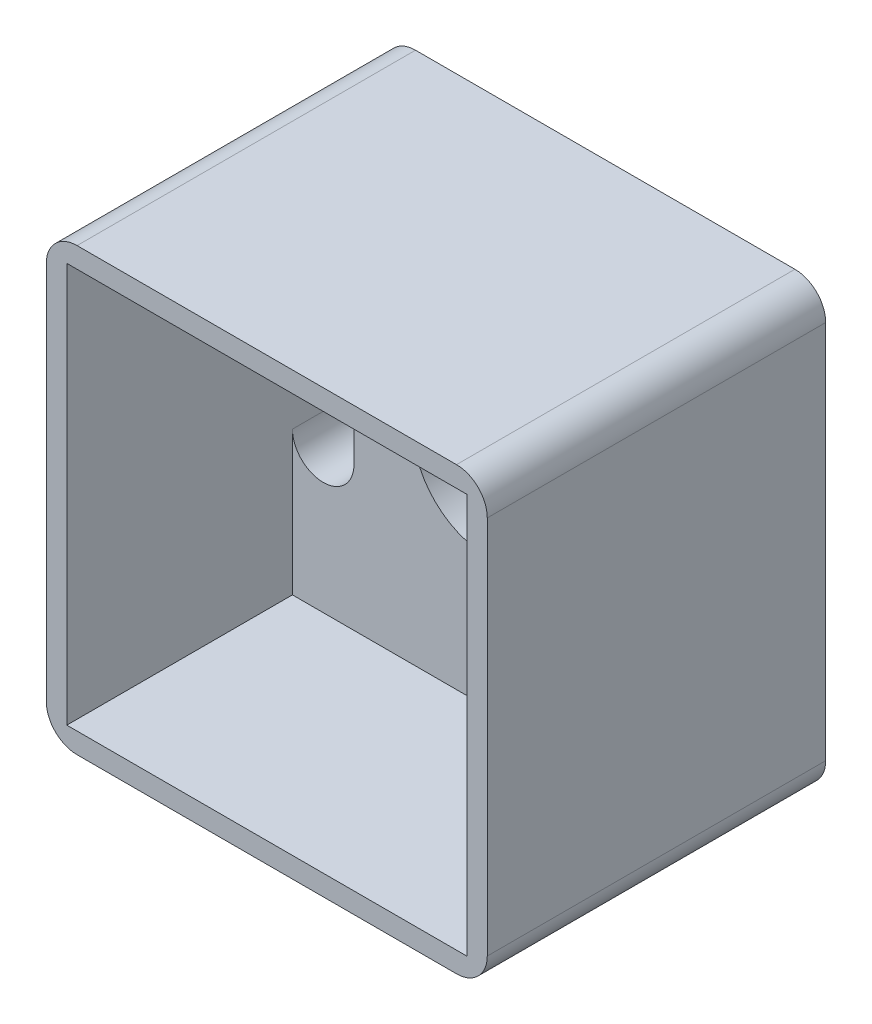
ISO-10303-21;
HEADER;
FILE_DESCRIPTION(('STEP AP214'),'2;1');
FILE_NAME('part.step','',(''),(''),'','','');
FILE_SCHEMA(('AUTOMOTIVE_DESIGN { 1 0 10303 214 1 1 1 1 }'));
ENDSEC;
DATA;
#1=APPLICATION_CONTEXT('core data for automotive mechanical design processes');
#2=APPLICATION_PROTOCOL_DEFINITION('international standard','automotive_design',2000,#1);
#3=PRODUCT_CONTEXT('',#1,'mechanical');
#4=PRODUCT('Part','Part','',(#3));
#5=PRODUCT_RELATED_PRODUCT_CATEGORY('part','',(#4));
#6=PRODUCT_DEFINITION_FORMATION('','',#4);
#7=PRODUCT_DEFINITION_CONTEXT('part definition',#1,'design');
#8=PRODUCT_DEFINITION('design','',#6,#7);
#9=PRODUCT_DEFINITION_SHAPE('','',#8);
#10=(LENGTH_UNIT() NAMED_UNIT(*) SI_UNIT(.MILLI.,.METRE.));
#11=(NAMED_UNIT(*) PLANE_ANGLE_UNIT() SI_UNIT($,.RADIAN.));
#12=(NAMED_UNIT(*) SI_UNIT($,.STERADIAN.) SOLID_ANGLE_UNIT());
#13=UNCERTAINTY_MEASURE_WITH_UNIT(LENGTH_MEASURE(1.E-05),#10,'distance_accuracy_value','');
#14=(GEOMETRIC_REPRESENTATION_CONTEXT(3) GLOBAL_UNCERTAINTY_ASSIGNED_CONTEXT((#13)) GLOBAL_UNIT_ASSIGNED_CONTEXT((#10,
#11,#12)) REPRESENTATION_CONTEXT('',''));
#15=CARTESIAN_POINT('',(0.,0.,0.));
#16=DIRECTION('',(0.,0.,1.));
#17=DIRECTION('',(1.,0.,0.));
#18=AXIS2_PLACEMENT_3D('',#15,#16,#17);
#19=CARTESIAN_POINT('',(-10.8125564669842,0.,12.));
#20=DIRECTION('',(1.,0.,0.));
#21=DIRECTION('',(0.,0.,-1.));
#22=AXIS2_PLACEMENT_3D('',#19,#20,#21);
#23=PLANE('',#22);
#24=DIRECTION('',(0.,0.,-1.));
#25=VECTOR('',#24,1.);
#26=CARTESIAN_POINT('',(-10.8125564669842,-23.2158524057952,0.));
#27=LINE('',#26,#25);
#28=CARTESIAN_POINT('',(-10.8125564669842,-23.2158524057952,12.));
#29=VERTEX_POINT('',#28);
#30=CARTESIAN_POINT('',(-10.8125564669842,-23.2158524057952,7.));
#31=VERTEX_POINT('',#30);
#32=EDGE_CURVE('E260',#29,#31,#27,.T.);
#33=ORIENTED_EDGE('',*,*,#32,.T.);
#34=DIRECTION('',(0.,1.,0.));
#35=VECTOR('',#34,1.);
#36=CARTESIAN_POINT('',(-10.8125564669842,0.,7.));
#37=LINE('',#36,#35);
#38=CARTESIAN_POINT('',(-10.8125564669842,-14.8158524057952,7.));
#39=VERTEX_POINT('',#38);
#40=EDGE_CURVE('E748',#31,#39,#37,.T.);
#41=ORIENTED_EDGE('',*,*,#40,.T.);
#42=DIRECTION('',(0.,0.,-1.));
#43=VECTOR('',#42,1.);
#44=CARTESIAN_POINT('',(-10.8125564669842,-14.8158524057952,12.));
#45=LINE('',#44,#43);
#46=CARTESIAN_POINT('',(-10.8125564669842,-14.8158524057952,12.));
#47=VERTEX_POINT('',#46);
#48=EDGE_CURVE('E258',#39,#47,#45,.F.);
#49=ORIENTED_EDGE('',*,*,#48,.T.);
#50=DIRECTION('',(0.,-1.,0.));
#51=VECTOR('',#50,1.);
#52=CARTESIAN_POINT('',(-10.8125564669842,0.,12.));
#53=LINE('',#52,#51);
#54=EDGE_CURVE('E410',#47,#29,#53,.T.);
#55=ORIENTED_EDGE('',*,*,#54,.T.);
#56=EDGE_LOOP('',(#33,#41,#49,#55));
#57=FACE_BOUND('',#56,.T.);
#58=ADVANCED_FACE('F39',(#57),#23,.T.);
#59=CARTESIAN_POINT('',(0.,-28.2158524057952,12.));
#60=DIRECTION('',(0.,1.,0.));
#61=DIRECTION('',(0.,0.,1.));
#62=AXIS2_PLACEMENT_3D('',#59,#60,#61);
#63=PLANE('',#62);
#64=DIRECTION('',(-1.,0.,0.));
#65=VECTOR('',#64,1.);
#66=CARTESIAN_POINT('',(0.,-28.2158524057952,7.));
#67=LINE('',#66,#65);
#68=CARTESIAN_POINT('',(-15.8125564669842,-28.2158524057952,7.));
#69=VERTEX_POINT('',#68);
#70=CARTESIAN_POINT('',(-24.2125564669842,-28.2158524057952,7.));
#71=VERTEX_POINT('',#70);
#72=EDGE_CURVE('E53',#69,#71,#67,.T.);
#73=ORIENTED_EDGE('',*,*,#72,.F.);
#74=DIRECTION('',(0.,0.,-1.));
#75=VECTOR('',#74,1.);
#76=CARTESIAN_POINT('',(-15.8125564669842,-28.2158524057952,12.));
#77=LINE('',#76,#75);
#78=CARTESIAN_POINT('',(-15.8125564669842,-28.2158524057952,12.));
#79=VERTEX_POINT('',#78);
#80=EDGE_CURVE('E262',#69,#79,#77,.F.);
#81=ORIENTED_EDGE('',*,*,#80,.T.);
#82=DIRECTION('',(1.,0.,0.));
#83=VECTOR('',#82,1.);
#84=CARTESIAN_POINT('',(0.,-28.2158524057952,12.));
#85=LINE('',#84,#83);
#86=CARTESIAN_POINT('',(-24.2125564669842,-28.2158524057952,12.));
#87=VERTEX_POINT('',#86);
#88=EDGE_CURVE('E316',#87,#79,#85,.T.);
#89=ORIENTED_EDGE('',*,*,#88,.F.);
#90=DIRECTION('',(0.,0.,-1.));
#91=VECTOR('',#90,1.);
#92=CARTESIAN_POINT('',(-24.2125564669842,-28.2158524057952,12.));
#93=LINE('',#92,#91);
#94=EDGE_CURVE('E265',#87,#71,#93,.T.);
#95=ORIENTED_EDGE('',*,*,#94,.T.);
#96=EDGE_LOOP('',(#73,#81,#89,#95));
#97=FACE_BOUND('',#96,.T.);
#98=ADVANCED_FACE('F518',(#97),#63,.F.);
#99=CARTESIAN_POINT('',(-29.2125564669842,0.,12.));
#100=DIRECTION('',(1.,0.,0.));
#101=DIRECTION('',(0.,0.,-1.));
#102=AXIS2_PLACEMENT_3D('',#99,#100,#101);
#103=PLANE('',#102);
#104=DIRECTION('',(0.,1.,0.));
#105=VECTOR('',#104,1.);
#106=CARTESIAN_POINT('',(-29.2125564669842,0.,7.));
#107=LINE('',#106,#105);
#108=CARTESIAN_POINT('',(-29.2125564669842,-23.2158524057952,7.));
#109=VERTEX_POINT('',#108);
#110=CARTESIAN_POINT('',(-29.2125564669842,-14.8158524057952,7.));
#111=VERTEX_POINT('',#110);
#112=EDGE_CURVE('E224',#109,#111,#107,.T.);
#113=ORIENTED_EDGE('',*,*,#112,.F.);
#114=DIRECTION('',(0.,0.,-1.));
#115=VECTOR('',#114,1.);
#116=CARTESIAN_POINT('',(-29.2125564669842,-23.2158524057952,12.));
#117=LINE('',#116,#115);
#118=CARTESIAN_POINT('',(-29.2125564669842,-23.2158524057952,12.));
#119=VERTEX_POINT('',#118);
#120=EDGE_CURVE('E232',#109,#119,#117,.F.);
#121=ORIENTED_EDGE('',*,*,#120,.T.);
#122=DIRECTION('',(0.,-1.,0.));
#123=VECTOR('',#122,1.);
#124=CARTESIAN_POINT('',(-29.2125564669842,0.,12.));
#125=LINE('',#124,#123);
#126=CARTESIAN_POINT('',(-29.2125564669842,-14.8158524057952,12.));
#127=VERTEX_POINT('',#126);
#128=EDGE_CURVE('E321',#127,#119,#125,.T.);
#129=ORIENTED_EDGE('',*,*,#128,.F.);
#130=DIRECTION('',(0.,0.,-1.));
#131=VECTOR('',#130,1.);
#132=CARTESIAN_POINT('',(-29.2125564669842,-14.8158524057952,0.));
#133=LINE('',#132,#131);
#134=EDGE_CURVE('E238',#127,#111,#133,.T.);
#135=ORIENTED_EDGE('',*,*,#134,.T.);
#136=EDGE_LOOP('',(#113,#121,#129,#135));
#137=FACE_BOUND('',#136,.T.);
#138=ADVANCED_FACE('F231',(#137),#103,.F.);
#139=CARTESIAN_POINT('',(0.,-9.81585240579516,12.));
#140=DIRECTION('',(0.,1.,0.));
#141=DIRECTION('',(0.,0.,1.));
#142=AXIS2_PLACEMENT_3D('',#139,#140,#141);
#143=PLANE('',#142);
#144=DIRECTION('',(0.,0.,-1.));
#145=VECTOR('',#144,1.);
#146=CARTESIAN_POINT('',(-15.8125564669842,-9.81585240579516,12.));
#147=LINE('',#146,#145);
#148=CARTESIAN_POINT('',(-15.8125564669842,-9.81585240579516,12.));
#149=VERTEX_POINT('',#148);
#150=CARTESIAN_POINT('',(-15.8125564669842,-9.81585240579516,7.));
#151=VERTEX_POINT('',#150);
#152=EDGE_CURVE('E244',#149,#151,#147,.T.);
#153=ORIENTED_EDGE('',*,*,#152,.T.);
#154=DIRECTION('',(-1.,0.,0.));
#155=VECTOR('',#154,1.);
#156=CARTESIAN_POINT('',(0.,-9.81585240579516,7.));
#157=LINE('',#156,#155);
#158=CARTESIAN_POINT('',(-24.2125564669842,-9.81585240579516,7.));
#159=VERTEX_POINT('',#158);
#160=EDGE_CURVE('E736',#151,#159,#157,.T.);
#161=ORIENTED_EDGE('',*,*,#160,.T.);
#162=DIRECTION('',(0.,0.,-1.));
#163=VECTOR('',#162,1.);
#164=CARTESIAN_POINT('',(-24.2125564669842,-9.81585240579516,12.));
#165=LINE('',#164,#163);
#166=CARTESIAN_POINT('',(-24.2125564669842,-9.81585240579516,12.));
#167=VERTEX_POINT('',#166);
#168=EDGE_CURVE('E253',#159,#167,#165,.F.);
#169=ORIENTED_EDGE('',*,*,#168,.T.);
#170=DIRECTION('',(1.,0.,0.));
#171=VECTOR('',#170,1.);
#172=CARTESIAN_POINT('',(0.,-9.81585240579516,12.));
#173=LINE('',#172,#171);
#174=EDGE_CURVE('E741',#167,#149,#173,.T.);
#175=ORIENTED_EDGE('',*,*,#174,.T.);
#176=EDGE_LOOP('',(#153,#161,#169,#175));
#177=FACE_BOUND('',#176,.T.);
#178=ADVANCED_FACE('F532',(#177),#143,.T.);
#179=CARTESIAN_POINT('',(-24.2125564669842,-14.8158524057952,12.));
#180=DIRECTION('',(0.,0.,1.));
#181=DIRECTION('',(1.,0.,0.));
#182=AXIS2_PLACEMENT_3D('',#179,#180,#181);
#183=CYLINDRICAL_SURFACE('',#182,5.);
#184=ORIENTED_EDGE('',*,*,#168,.F.);
#185=CARTESIAN_POINT('',(-24.2125564669842,-14.8158524057952,7.));
#186=DIRECTION('',(0.,0.,-1.));
#187=DIRECTION('',(-1.,0.,0.));
#188=AXIS2_PLACEMENT_3D('',#185,#186,#187);
#189=CIRCLE('',#188,5.);
#190=EDGE_CURVE('E760',#159,#111,#189,.F.);
#191=ORIENTED_EDGE('',*,*,#190,.T.);
#192=ORIENTED_EDGE('',*,*,#134,.F.);
#193=CARTESIAN_POINT('',(-24.2125564669842,-14.8158524057952,12.));
#194=DIRECTION('',(0.,0.,-1.));
#195=DIRECTION('',(-1.,0.,0.));
#196=AXIS2_PLACEMENT_3D('',#193,#194,#195);
#197=CIRCLE('',#196,5.);
#198=EDGE_CURVE('E266',#167,#127,#197,.F.);
#199=ORIENTED_EDGE('',*,*,#198,.F.);
#200=EDGE_LOOP('',(#184,#191,#192,#199));
#201=FACE_BOUND('',#200,.T.);
#202=ADVANCED_FACE('F690',(#201),#183,.T.);
#203=CARTESIAN_POINT('',(-15.8125564669842,-14.8158524057952,12.));
#204=DIRECTION('',(0.,0.,-1.));
#205=DIRECTION('',(-1.,0.,0.));
#206=AXIS2_PLACEMENT_3D('',#203,#204,#205);
#207=CYLINDRICAL_SURFACE('',#206,5.);
#208=ORIENTED_EDGE('',*,*,#48,.F.);
#209=CARTESIAN_POINT('',(-15.8125564669842,-14.8158524057952,7.));
#210=DIRECTION('',(0.,0.,-1.));
#211=DIRECTION('',(-1.,0.,0.));
#212=AXIS2_PLACEMENT_3D('',#209,#210,#211);
#213=CIRCLE('',#212,5.);
#214=EDGE_CURVE('E409',#39,#151,#213,.F.);
#215=ORIENTED_EDGE('',*,*,#214,.T.);
#216=ORIENTED_EDGE('',*,*,#152,.F.);
#217=CARTESIAN_POINT('',(-15.8125564669842,-14.8158524057952,12.));
#218=DIRECTION('',(0.,0.,-1.));
#219=DIRECTION('',(-1.,0.,0.));
#220=AXIS2_PLACEMENT_3D('',#217,#218,#219);
#221=CIRCLE('',#220,5.);
#222=EDGE_CURVE('E268',#47,#149,#221,.F.);
#223=ORIENTED_EDGE('',*,*,#222,.F.);
#224=EDGE_LOOP('',(#208,#215,#216,#223));
#225=FACE_BOUND('',#224,.T.);
#226=ADVANCED_FACE('F678',(#225),#207,.T.);
#227=CARTESIAN_POINT('',(-15.8125564669842,-23.2158524057952,12.));
#228=DIRECTION('',(0.,0.,1.));
#229=DIRECTION('',(1.,0.,0.));
#230=AXIS2_PLACEMENT_3D('',#227,#228,#229);
#231=CYLINDRICAL_SURFACE('',#230,5.);
#232=ORIENTED_EDGE('',*,*,#80,.F.);
#233=CARTESIAN_POINT('',(-15.8125564669842,-23.2158524057952,7.));
#234=DIRECTION('',(0.,0.,-1.));
#235=DIRECTION('',(-1.,0.,0.));
#236=AXIS2_PLACEMENT_3D('',#233,#234,#235);
#237=CIRCLE('',#236,5.);
#238=EDGE_CURVE('E758',#69,#31,#237,.F.);
#239=ORIENTED_EDGE('',*,*,#238,.T.);
#240=ORIENTED_EDGE('',*,*,#32,.F.);
#241=CARTESIAN_POINT('',(-15.8125564669842,-23.2158524057952,12.));
#242=DIRECTION('',(0.,0.,-1.));
#243=DIRECTION('',(-1.,0.,0.));
#244=AXIS2_PLACEMENT_3D('',#241,#242,#243);
#245=CIRCLE('',#244,5.);
#246=EDGE_CURVE('E269',#79,#29,#245,.F.);
#247=ORIENTED_EDGE('',*,*,#246,.F.);
#248=EDGE_LOOP('',(#232,#239,#240,#247));
#249=FACE_BOUND('',#248,.T.);
#250=ADVANCED_FACE('F668',(#249),#231,.T.);
#251=CARTESIAN_POINT('',(-24.2125564669842,-23.2158524057952,12.));
#252=DIRECTION('',(0.,0.,-1.));
#253=DIRECTION('',(-1.,0.,0.));
#254=AXIS2_PLACEMENT_3D('',#251,#252,#253);
#255=CYLINDRICAL_SURFACE('',#254,5.);
#256=ORIENTED_EDGE('',*,*,#120,.F.);
#257=CARTESIAN_POINT('',(-24.2125564669842,-23.2158524057952,7.));
#258=DIRECTION('',(0.,0.,-1.));
#259=DIRECTION('',(-1.,0.,0.));
#260=AXIS2_PLACEMENT_3D('',#257,#258,#259);
#261=CIRCLE('',#260,5.);
#262=EDGE_CURVE('E11',#109,#71,#261,.F.);
#263=ORIENTED_EDGE('',*,*,#262,.T.);
#264=ORIENTED_EDGE('',*,*,#94,.F.);
#265=CARTESIAN_POINT('',(-24.2125564669842,-23.2158524057952,12.));
#266=DIRECTION('',(0.,0.,-1.));
#267=DIRECTION('',(-1.,0.,0.));
#268=AXIS2_PLACEMENT_3D('',#265,#266,#267);
#269=CIRCLE('',#268,5.);
#270=EDGE_CURVE('E245',#119,#87,#269,.F.);
#271=ORIENTED_EDGE('',*,*,#270,.F.);
#272=EDGE_LOOP('',(#256,#263,#264,#271));
#273=FACE_BOUND('',#272,.T.);
#274=ADVANCED_FACE('F241',(#273),#255,.T.);
#275=CARTESIAN_POINT('',(-41.,-41.,45.));
#276=DIRECTION('',(0.,1.,0.));
#277=DIRECTION('',(-1.,0.,0.));
#278=AXIS2_PLACEMENT_3D('',#275,#276,#277);
#279=PLANE('',#278);
#280=DIRECTION('',(1.,0.,0.));
#281=VECTOR('',#280,1.);
#282=CARTESIAN_POINT('',(-41.,-41.,45.));
#283=LINE('',#282,#281);
#284=CARTESIAN_POINT('',(-38.,-41.,45.));
#285=VERTEX_POINT('',#284);
#286=CARTESIAN_POINT('',(-0.999999999999987,-41.,45.));
#287=VERTEX_POINT('',#286);
#288=EDGE_CURVE('E243',#285,#287,#283,.T.);
#289=ORIENTED_EDGE('',*,*,#288,.F.);
#290=DIRECTION('',(0.,0.,-1.));
#291=VECTOR('',#290,1.);
#292=CARTESIAN_POINT('',(-38.,-41.,12.));
#293=LINE('',#292,#291);
#294=CARTESIAN_POINT('',(-38.,-41.,12.));
#295=VERTEX_POINT('',#294);
#296=EDGE_CURVE('E50',#285,#295,#293,.T.);
#297=ORIENTED_EDGE('',*,*,#296,.T.);
#298=DIRECTION('',(-1.,0.,0.));
#299=VECTOR('',#298,1.);
#300=CARTESIAN_POINT('',(0.,-41.,12.));
#301=LINE('',#300,#299);
#302=CARTESIAN_POINT('',(-0.999999999999989,-41.,12.));
#303=VERTEX_POINT('',#302);
#304=EDGE_CURVE('E308',#303,#295,#301,.T.);
#305=ORIENTED_EDGE('',*,*,#304,.F.);
#306=DIRECTION('',(0.,0.,-1.));
#307=VECTOR('',#306,1.);
#308=CARTESIAN_POINT('',(-0.999999999999987,-41.,45.));
#309=LINE('',#308,#307);
#310=EDGE_CURVE('E62',#303,#287,#309,.F.);
#311=ORIENTED_EDGE('',*,*,#310,.T.);
#312=EDGE_LOOP('',(#289,#297,#305,#311));
#313=FACE_BOUND('',#312,.T.);
#314=ADVANCED_FACE('F310',(#313),#279,.F.);
#315=CARTESIAN_POINT('',(2.00000000000001,-41.,45.));
#316=DIRECTION('',(-1.,0.,0.));
#317=DIRECTION('',(0.,0.,1.));
#318=AXIS2_PLACEMENT_3D('',#315,#316,#317);
#319=PLANE('',#318);
#320=DIRECTION('',(0.,-1.,0.));
#321=VECTOR('',#320,1.);
#322=CARTESIAN_POINT('',(2.00000000000001,0.,12.));
#323=LINE('',#322,#321);
#324=CARTESIAN_POINT('',(2.00000000000001,-0.999999999999991,12.));
#325=VERTEX_POINT('',#324);
#326=CARTESIAN_POINT('',(2.00000000000001,-38.,12.));
#327=VERTEX_POINT('',#326);
#328=EDGE_CURVE('E327',#325,#327,#323,.T.);
#329=ORIENTED_EDGE('',*,*,#328,.F.);
#330=DIRECTION('',(0.,0.,-1.));
#331=VECTOR('',#330,1.);
#332=CARTESIAN_POINT('',(2.00000000000001,-0.999999999999991,45.));
#333=LINE('',#332,#331);
#334=CARTESIAN_POINT('',(2.00000000000001,-0.999999999999994,45.));
#335=VERTEX_POINT('',#334);
#336=EDGE_CURVE('E287',#325,#335,#333,.F.);
#337=ORIENTED_EDGE('',*,*,#336,.T.);
#338=DIRECTION('',(0.,1.,0.));
#339=VECTOR('',#338,1.);
#340=CARTESIAN_POINT('',(2.00000000000001,-41.,45.));
#341=LINE('',#340,#339);
#342=CARTESIAN_POINT('',(2.00000000000001,-38.,45.));
#343=VERTEX_POINT('',#342);
#344=EDGE_CURVE('E250',#343,#335,#341,.T.);
#345=ORIENTED_EDGE('',*,*,#344,.F.);
#346=DIRECTION('',(0.,0.,-1.));
#347=VECTOR('',#346,1.);
#348=CARTESIAN_POINT('',(2.00000000000001,-38.,45.));
#349=LINE('',#348,#347);
#350=EDGE_CURVE('E286',#343,#327,#349,.T.);
#351=ORIENTED_EDGE('',*,*,#350,.T.);
#352=EDGE_LOOP('',(#329,#337,#345,#351));
#353=FACE_BOUND('',#352,.T.);
#354=ADVANCED_FACE('F552',(#353),#319,.F.);
#355=CARTESIAN_POINT('',(-36.,-13.,7.));
#356=DIRECTION('',(0.,0.,1.));
#357=DIRECTION('',(1.,0.,0.));
#358=AXIS2_PLACEMENT_3D('',#355,#356,#357);
#359=CYLINDRICAL_SURFACE('',#358,3.);
#360=CARTESIAN_POINT('',(-36.,-13.,12.));
#361=DIRECTION('',(0.,0.,-1.));
#362=DIRECTION('',(-1.,0.,0.));
#363=AXIS2_PLACEMENT_3D('',#360,#361,#362);
#364=CIRCLE('',#363,3.);
#365=CARTESIAN_POINT('',(-33.,-13.,12.));
#366=VERTEX_POINT('',#365);
#367=CARTESIAN_POINT('',(-39.,-13.,12.));
#368=VERTEX_POINT('',#367);
#369=EDGE_CURVE('E350',#366,#368,#364,.F.);
#370=ORIENTED_EDGE('',*,*,#369,.F.);
#371=DIRECTION('',(0.,0.,1.));
#372=VECTOR('',#371,1.);
#373=CARTESIAN_POINT('',(-33.,-13.,7.));
#374=LINE('',#373,#372);
#375=CARTESIAN_POINT('',(-33.,-13.,23.));
#376=VERTEX_POINT('',#375);
#377=EDGE_CURVE('E401',#366,#376,#374,.T.);
#378=ORIENTED_EDGE('',*,*,#377,.T.);
#379=CARTESIAN_POINT('',(-36.,-13.,23.));
#380=DIRECTION('',(0.,0.,1.));
#381=DIRECTION('',(1.,0.,0.));
#382=AXIS2_PLACEMENT_3D('',#379,#380,#381);
#383=CIRCLE('',#382,3.);
#384=CARTESIAN_POINT('',(-39.,-13.,23.));
#385=VERTEX_POINT('',#384);
#386=EDGE_CURVE('E399',#385,#376,#383,.F.);
#387=ORIENTED_EDGE('',*,*,#386,.F.);
#388=DIRECTION('',(0.,0.,1.));
#389=VECTOR('',#388,1.);
#390=CARTESIAN_POINT('',(-39.,-13.,7.));
#391=LINE('',#390,#389);
#392=EDGE_CURVE('E423',#368,#385,#391,.T.);
#393=ORIENTED_EDGE('',*,*,#392,.F.);
#394=EDGE_LOOP('',(#370,#378,#387,#393));
#395=FACE_BOUND('',#394,.T.);
#396=ADVANCED_FACE('F470',(#395),#359,.F.);
#397=CARTESIAN_POINT('',(-33.,-13.,7.));
#398=DIRECTION('',(-1.,0.,0.));
#399=DIRECTION('',(0.,-1.,0.));
#400=AXIS2_PLACEMENT_3D('',#397,#398,#399);
#401=PLANE('',#400);
#402=ORIENTED_EDGE('',*,*,#377,.F.);
#403=DIRECTION('',(0.,-1.,0.));
#404=VECTOR('',#403,1.);
#405=CARTESIAN_POINT('',(-33.,-13.,12.));
#406=LINE('',#405,#404);
#407=CARTESIAN_POINT('',(-33.,-25.,12.));
#408=VERTEX_POINT('',#407);
#409=EDGE_CURVE('E341',#366,#408,#406,.T.);
#410=ORIENTED_EDGE('',*,*,#409,.T.);
#411=DIRECTION('',(0.,0.,1.));
#412=VECTOR('',#411,1.);
#413=CARTESIAN_POINT('',(-33.,-25.,7.));
#414=LINE('',#413,#412);
#415=CARTESIAN_POINT('',(-33.,-25.,23.));
#416=VERTEX_POINT('',#415);
#417=EDGE_CURVE('E424',#408,#416,#414,.T.);
#418=ORIENTED_EDGE('',*,*,#417,.T.);
#419=DIRECTION('',(0.,1.,0.));
#420=VECTOR('',#419,1.);
#421=CARTESIAN_POINT('',(-33.,-13.,23.));
#422=LINE('',#421,#420);
#423=EDGE_CURVE('E400',#416,#376,#422,.T.);
#424=ORIENTED_EDGE('',*,*,#423,.T.);
#425=EDGE_LOOP('',(#402,#410,#418,#424));
#426=FACE_BOUND('',#425,.T.);
#427=ADVANCED_FACE('F475',(#426),#401,.T.);
#428=CARTESIAN_POINT('',(-36.,-25.,7.));
#429=DIRECTION('',(0.,0.,1.));
#430=DIRECTION('',(1.,0.,0.));
#431=AXIS2_PLACEMENT_3D('',#428,#429,#430);
#432=CYLINDRICAL_SURFACE('',#431,3.);
#433=CARTESIAN_POINT('',(-36.,-25.,12.));
#434=DIRECTION('',(0.,0.,-1.));
#435=DIRECTION('',(-1.,0.,0.));
#436=AXIS2_PLACEMENT_3D('',#433,#434,#435);
#437=CIRCLE('',#436,3.);
#438=CARTESIAN_POINT('',(-39.,-25.,12.));
#439=VERTEX_POINT('',#438);
#440=EDGE_CURVE('E345',#439,#408,#437,.F.);
#441=ORIENTED_EDGE('',*,*,#440,.F.);
#442=DIRECTION('',(0.,0.,1.));
#443=VECTOR('',#442,1.);
#444=CARTESIAN_POINT('',(-39.,-25.,7.));
#445=LINE('',#444,#443);
#446=CARTESIAN_POINT('',(-39.,-25.,23.));
#447=VERTEX_POINT('',#446);
#448=EDGE_CURVE('E421',#439,#447,#445,.T.);
#449=ORIENTED_EDGE('',*,*,#448,.T.);
#450=CARTESIAN_POINT('',(-36.,-25.,23.));
#451=DIRECTION('',(0.,0.,1.));
#452=DIRECTION('',(1.,0.,0.));
#453=AXIS2_PLACEMENT_3D('',#450,#451,#452);
#454=CIRCLE('',#453,3.);
#455=EDGE_CURVE('E392',#416,#447,#454,.F.);
#456=ORIENTED_EDGE('',*,*,#455,.F.);
#457=ORIENTED_EDGE('',*,*,#417,.F.);
#458=EDGE_LOOP('',(#441,#449,#456,#457));
#459=FACE_BOUND('',#458,.T.);
#460=ADVANCED_FACE('F473',(#459),#432,.F.);
#461=CARTESIAN_POINT('',(-6.,0.,7.));
#462=DIRECTION('',(-1.,0.,0.));
#463=DIRECTION('',(0.,-1.,0.));
#464=AXIS2_PLACEMENT_3D('',#461,#462,#463);
#465=PLANE('',#464);
#466=DIRECTION('',(0.,-1.,0.));
#467=VECTOR('',#466,1.);
#468=CARTESIAN_POINT('',(-6.,0.,12.));
#469=LINE('',#468,#467);
#470=CARTESIAN_POINT('',(-6.,-13.,12.));
#471=VERTEX_POINT('',#470);
#472=CARTESIAN_POINT('',(-5.99999999999999,-25.,12.));
#473=VERTEX_POINT('',#472);
#474=EDGE_CURVE('E336',#471,#473,#469,.T.);
#475=ORIENTED_EDGE('',*,*,#474,.F.);
#476=DIRECTION('',(0.,0.,1.));
#477=VECTOR('',#476,1.);
#478=CARTESIAN_POINT('',(-6.,-13.,7.));
#479=LINE('',#478,#477);
#480=CARTESIAN_POINT('',(-6.,-13.,23.));
#481=VERTEX_POINT('',#480);
#482=EDGE_CURVE('E416',#471,#481,#479,.T.);
#483=ORIENTED_EDGE('',*,*,#482,.T.);
#484=DIRECTION('',(0.,1.,0.));
#485=VECTOR('',#484,1.);
#486=CARTESIAN_POINT('',(-6.,0.,23.));
#487=LINE('',#486,#485);
#488=CARTESIAN_POINT('',(-5.99999999999999,-25.,23.));
#489=VERTEX_POINT('',#488);
#490=EDGE_CURVE('E389',#489,#481,#487,.T.);
#491=ORIENTED_EDGE('',*,*,#490,.F.);
#492=DIRECTION('',(0.,0.,1.));
#493=VECTOR('',#492,1.);
#494=CARTESIAN_POINT('',(-5.99999999999999,-25.,7.));
#495=LINE('',#494,#493);
#496=EDGE_CURVE('E406',#473,#489,#495,.T.);
#497=ORIENTED_EDGE('',*,*,#496,.F.);
#498=EDGE_LOOP('',(#475,#483,#491,#497));
#499=FACE_BOUND('',#498,.T.);
#500=ADVANCED_FACE('F495',(#499),#465,.F.);
#501=CARTESIAN_POINT('',(-3.,-13.,7.));
#502=DIRECTION('',(0.,0.,1.));
#503=DIRECTION('',(1.,0.,0.));
#504=AXIS2_PLACEMENT_3D('',#501,#502,#503);
#505=CYLINDRICAL_SURFACE('',#504,3.);
#506=CARTESIAN_POINT('',(-3.,-13.,12.));
#507=DIRECTION('',(0.,0.,-1.));
#508=DIRECTION('',(-1.,0.,0.));
#509=AXIS2_PLACEMENT_3D('',#506,#507,#508);
#510=CIRCLE('',#509,3.);
#511=CARTESIAN_POINT('',(0.,-13.,12.));
#512=VERTEX_POINT('',#511);
#513=EDGE_CURVE('E337',#512,#471,#510,.F.);
#514=ORIENTED_EDGE('',*,*,#513,.F.);
#515=DIRECTION('',(0.,0.,1.));
#516=VECTOR('',#515,1.);
#517=CARTESIAN_POINT('',(0.,-13.,7.));
#518=LINE('',#517,#516);
#519=CARTESIAN_POINT('',(0.,-13.,23.));
#520=VERTEX_POINT('',#519);
#521=EDGE_CURVE('E412',#512,#520,#518,.T.);
#522=ORIENTED_EDGE('',*,*,#521,.T.);
#523=CARTESIAN_POINT('',(-3.,-13.,23.));
#524=DIRECTION('',(0.,0.,1.));
#525=DIRECTION('',(1.,0.,0.));
#526=AXIS2_PLACEMENT_3D('',#523,#524,#525);
#527=CIRCLE('',#526,3.);
#528=EDGE_CURVE('E393',#481,#520,#527,.F.);
#529=ORIENTED_EDGE('',*,*,#528,.F.);
#530=ORIENTED_EDGE('',*,*,#482,.F.);
#531=EDGE_LOOP('',(#514,#522,#529,#530));
#532=FACE_BOUND('',#531,.T.);
#533=ADVANCED_FACE('F498',(#532),#505,.F.);
#534=CARTESIAN_POINT('',(-3.,-25.,7.));
#535=DIRECTION('',(0.,0.,1.));
#536=DIRECTION('',(1.,0.,0.));
#537=AXIS2_PLACEMENT_3D('',#534,#535,#536);
#538=CYLINDRICAL_SURFACE('',#537,3.);
#539=CARTESIAN_POINT('',(-3.,-25.,12.));
#540=DIRECTION('',(0.,0.,-1.));
#541=DIRECTION('',(-1.,0.,0.));
#542=AXIS2_PLACEMENT_3D('',#539,#540,#541);
#543=CIRCLE('',#542,3.);
#544=CARTESIAN_POINT('',(0.,-25.,12.));
#545=VERTEX_POINT('',#544);
#546=EDGE_CURVE('E332',#473,#545,#543,.F.);
#547=ORIENTED_EDGE('',*,*,#546,.F.);
#548=ORIENTED_EDGE('',*,*,#496,.T.);
#549=CARTESIAN_POINT('',(-3.,-25.,23.));
#550=DIRECTION('',(0.,0.,1.));
#551=DIRECTION('',(1.,0.,0.));
#552=AXIS2_PLACEMENT_3D('',#549,#550,#551);
#553=CIRCLE('',#552,3.);
#554=CARTESIAN_POINT('',(0.,-25.,23.));
#555=VERTEX_POINT('',#554);
#556=EDGE_CURVE('E383',#555,#489,#553,.F.);
#557=ORIENTED_EDGE('',*,*,#556,.F.);
#558=DIRECTION('',(0.,0.,1.));
#559=VECTOR('',#558,1.);
#560=CARTESIAN_POINT('',(0.,-25.,7.));
#561=LINE('',#560,#559);
#562=EDGE_CURVE('E415',#545,#555,#561,.T.);
#563=ORIENTED_EDGE('',*,*,#562,.F.);
#564=EDGE_LOOP('',(#547,#548,#557,#563));
#565=FACE_BOUND('',#564,.T.);
#566=ADVANCED_FACE('F486',(#565),#538,.F.);
#567=CARTESIAN_POINT('',(-39.,-13.,7.));
#568=DIRECTION('',(-1.,0.,0.));
#569=DIRECTION('',(0.,-1.,0.));
#570=AXIS2_PLACEMENT_3D('',#567,#568,#569);
#571=PLANE('',#570);
#572=DIRECTION('',(0.,-1.,0.));
#573=VECTOR('',#572,1.);
#574=CARTESIAN_POINT('',(-39.,-13.,12.));
#575=LINE('',#574,#573);
#576=EDGE_CURVE('E338',#368,#439,#575,.T.);
#577=ORIENTED_EDGE('',*,*,#576,.F.);
#578=ORIENTED_EDGE('',*,*,#392,.T.);
#579=DIRECTION('',(0.,-1.,0.));
#580=VECTOR('',#579,1.);
#581=CARTESIAN_POINT('',(-39.,0.,23.));
#582=LINE('',#581,#580);
#583=CARTESIAN_POINT('',(-39.,0.,23.));
#584=VERTEX_POINT('',#583);
#585=EDGE_CURVE('E356',#584,#385,#582,.T.);
#586=ORIENTED_EDGE('',*,*,#585,.F.);
#587=DIRECTION('',(0.,0.,1.));
#588=VECTOR('',#587,1.);
#589=CARTESIAN_POINT('',(-39.,0.,23.));
#590=LINE('',#589,#588);
#591=CARTESIAN_POINT('',(-39.,0.,45.));
#592=VERTEX_POINT('',#591);
#593=EDGE_CURVE('E380',#584,#592,#590,.T.);
#594=ORIENTED_EDGE('',*,*,#593,.T.);
#595=DIRECTION('',(0.,-1.,0.));
#596=VECTOR('',#595,1.);
#597=CARTESIAN_POINT('',(-39.,-13.,45.));
#598=LINE('',#597,#596);
#599=CARTESIAN_POINT('',(-39.,-39.,45.));
#600=VERTEX_POINT('',#599);
#601=EDGE_CURVE('E418',#592,#600,#598,.T.);
#602=ORIENTED_EDGE('',*,*,#601,.T.);
#603=DIRECTION('',(0.,0.,1.));
#604=VECTOR('',#603,1.);
#605=CARTESIAN_POINT('',(-39.,-39.,23.));
#606=LINE('',#605,#604);
#607=CARTESIAN_POINT('',(-39.,-39.,23.));
#608=VERTEX_POINT('',#607);
#609=EDGE_CURVE('E372',#608,#600,#606,.T.);
#610=ORIENTED_EDGE('',*,*,#609,.F.);
#611=EDGE_CURVE('E357',#447,#608,#582,.T.);
#612=ORIENTED_EDGE('',*,*,#611,.F.);
#613=ORIENTED_EDGE('',*,*,#448,.F.);
#614=EDGE_LOOP('',(#577,#578,#586,#594,#602,#610,#612,#613));
#615=FACE_BOUND('',#614,.T.);
#616=ADVANCED_FACE('F463',(#615),#571,.F.);
#617=CARTESIAN_POINT('',(0.,0.,7.));
#618=DIRECTION('',(-1.,0.,0.));
#619=DIRECTION('',(0.,0.,1.));
#620=AXIS2_PLACEMENT_3D('',#617,#618,#619);
#621=PLANE('',#620);
#622=ORIENTED_EDGE('',*,*,#521,.F.);
#623=DIRECTION('',(0.,-1.,0.));
#624=VECTOR('',#623,1.);
#625=CARTESIAN_POINT('',(0.,0.,12.));
#626=LINE('',#625,#624);
#627=EDGE_CURVE('E331',#512,#545,#626,.T.);
#628=ORIENTED_EDGE('',*,*,#627,.T.);
#629=ORIENTED_EDGE('',*,*,#562,.T.);
#630=DIRECTION('',(0.,1.,0.));
#631=VECTOR('',#630,1.);
#632=CARTESIAN_POINT('',(0.,-39.,23.));
#633=LINE('',#632,#631);
#634=CARTESIAN_POINT('',(0.,-39.,23.));
#635=VERTEX_POINT('',#634);
#636=EDGE_CURVE('E349',#635,#555,#633,.T.);
#637=ORIENTED_EDGE('',*,*,#636,.F.);
#638=DIRECTION('',(0.,0.,1.));
#639=VECTOR('',#638,1.);
#640=CARTESIAN_POINT('',(0.,-39.,23.));
#641=LINE('',#640,#639);
#642=CARTESIAN_POINT('',(0.,-39.,45.));
#643=VERTEX_POINT('',#642);
#644=EDGE_CURVE('E369',#635,#643,#641,.T.);
#645=ORIENTED_EDGE('',*,*,#644,.T.);
#646=DIRECTION('',(0.,-1.,0.));
#647=VECTOR('',#646,1.);
#648=CARTESIAN_POINT('',(0.,0.,45.));
#649=LINE('',#648,#647);
#650=CARTESIAN_POINT('',(0.,0.,45.));
#651=VERTEX_POINT('',#650);
#652=EDGE_CURVE('E413',#651,#643,#649,.T.);
#653=ORIENTED_EDGE('',*,*,#652,.F.);
#654=DIRECTION('',(0.,0.,1.));
#655=VECTOR('',#654,1.);
#656=CARTESIAN_POINT('',(0.,0.,23.));
#657=LINE('',#656,#655);
#658=CARTESIAN_POINT('',(0.,0.,23.));
#659=VERTEX_POINT('',#658);
#660=EDGE_CURVE('E364',#659,#651,#657,.T.);
#661=ORIENTED_EDGE('',*,*,#660,.F.);
#662=EDGE_CURVE('E352',#520,#659,#633,.T.);
#663=ORIENTED_EDGE('',*,*,#662,.F.);
#664=EDGE_LOOP('',(#622,#628,#629,#637,#645,#653,#661,#663));
#665=FACE_BOUND('',#664,.T.);
#666=ADVANCED_FACE('F444',(#665),#621,.T.);
#667=CARTESIAN_POINT('',(-20.,-3.50676126122746,7.));
#668=DIRECTION('',(0.,0.,1.));
#669=DIRECTION('',(1.,0.,0.));
#670=AXIS2_PLACEMENT_3D('',#667,#668,#669);
#671=CYLINDRICAL_SURFACE('',#670,3.);
#672=CARTESIAN_POINT('',(-20.,-3.50676126122746,23.));
#673=DIRECTION('',(0.,0.,1.));
#674=DIRECTION('',(1.,0.,0.));
#675=AXIS2_PLACEMENT_3D('',#672,#673,#674);
#676=CIRCLE('',#675,3.);
#677=CARTESIAN_POINT('',(-17.,-3.50676126122746,23.));
#678=VERTEX_POINT('',#677);
#679=EDGE_CURVE('E373',#678,#678,#676,.F.);
#680=ORIENTED_EDGE('',*,*,#679,.F.);
#681=EDGE_LOOP('',(#680));
#682=FACE_BOUND('',#681,.T.);
#683=CARTESIAN_POINT('',(-20.,-3.50676126122746,12.));
#684=DIRECTION('',(0.,0.,-1.));
#685=DIRECTION('',(-1.,0.,0.));
#686=AXIS2_PLACEMENT_3D('',#683,#684,#685);
#687=CIRCLE('',#686,3.);
#688=CARTESIAN_POINT('',(-23.,-3.50676126122746,12.));
#689=VERTEX_POINT('',#688);
#690=EDGE_CURVE('E249',#689,#689,#687,.F.);
#691=ORIENTED_EDGE('',*,*,#690,.F.);
#692=EDGE_LOOP('',(#691));
#693=FACE_BOUND('',#692,.T.);
#694=ADVANCED_FACE('F441',(#682,#693),#671,.F.);
#695=CARTESIAN_POINT('',(0.,0.,45.));
#696=DIRECTION('',(0.,0.,-1.));
#697=DIRECTION('',(-1.,0.,0.));
#698=AXIS2_PLACEMENT_3D('',#695,#696,#697);
#699=PLANE('',#698);
#700=ORIENTED_EDGE('',*,*,#344,.T.);
#701=CARTESIAN_POINT('',(-0.999999999999994,-0.999999999999991,45.));
#702=DIRECTION('',(0.,0.,-1.));
#703=DIRECTION('',(-1.,0.,0.));
#704=AXIS2_PLACEMENT_3D('',#701,#702,#703);
#705=CIRCLE('',#704,3.);
#706=CARTESIAN_POINT('',(-0.999999999999994,2.00000000000001,45.));
#707=VERTEX_POINT('',#706);
#708=EDGE_CURVE('E300',#335,#707,#705,.F.);
#709=ORIENTED_EDGE('',*,*,#708,.T.);
#710=DIRECTION('',(1.,0.,0.));
#711=VECTOR('',#710,1.);
#712=CARTESIAN_POINT('',(-41.,2.,45.));
#713=LINE('',#712,#711);
#714=CARTESIAN_POINT('',(-38.,2.,45.));
#715=VERTEX_POINT('',#714);
#716=EDGE_CURVE('E431',#715,#707,#713,.T.);
#717=ORIENTED_EDGE('',*,*,#716,.F.);
#718=CARTESIAN_POINT('',(-38.,-1.00000000000001,45.));
#719=DIRECTION('',(0.,0.,-1.));
#720=DIRECTION('',(-1.,0.,0.));
#721=AXIS2_PLACEMENT_3D('',#718,#719,#720);
#722=CIRCLE('',#721,3.);
#723=CARTESIAN_POINT('',(-41.,-1.00000000000001,45.));
#724=VERTEX_POINT('',#723);
#725=EDGE_CURVE('E294',#715,#724,#722,.F.);
#726=ORIENTED_EDGE('',*,*,#725,.T.);
#727=DIRECTION('',(0.,1.,0.));
#728=VECTOR('',#727,1.);
#729=CARTESIAN_POINT('',(-41.,-41.,45.));
#730=LINE('',#729,#728);
#731=CARTESIAN_POINT('',(-41.,-38.,45.));
#732=VERTEX_POINT('',#731);
#733=EDGE_CURVE('E419',#732,#724,#730,.T.);
#734=ORIENTED_EDGE('',*,*,#733,.F.);
#735=CARTESIAN_POINT('',(-38.,-38.,45.));
#736=DIRECTION('',(0.,0.,-1.));
#737=DIRECTION('',(-1.,0.,0.));
#738=AXIS2_PLACEMENT_3D('',#735,#736,#737);
#739=CIRCLE('',#738,3.);
#740=EDGE_CURVE('E291',#732,#285,#739,.F.);
#741=ORIENTED_EDGE('',*,*,#740,.T.);
#742=ORIENTED_EDGE('',*,*,#288,.T.);
#743=CARTESIAN_POINT('',(-0.99999999999999,-38.,45.));
#744=DIRECTION('',(0.,0.,-1.));
#745=DIRECTION('',(-1.,0.,0.));
#746=AXIS2_PLACEMENT_3D('',#743,#744,#745);
#747=CIRCLE('',#746,3.);
#748=EDGE_CURVE('E293',#287,#343,#747,.F.);
#749=ORIENTED_EDGE('',*,*,#748,.T.);
#750=EDGE_LOOP('',(#700,#709,#717,#726,#734,#741,#742,#749));
#751=FACE_BOUND('',#750,.T.);
#752=DIRECTION('',(-1.,0.,0.));
#753=VECTOR('',#752,1.);
#754=CARTESIAN_POINT('',(0.,0.,45.));
#755=LINE('',#754,#753);
#756=EDGE_CURVE('E347',#651,#592,#755,.T.);
#757=ORIENTED_EDGE('',*,*,#756,.F.);
#758=ORIENTED_EDGE('',*,*,#652,.T.);
#759=DIRECTION('',(1.,0.,0.));
#760=VECTOR('',#759,1.);
#761=CARTESIAN_POINT('',(-39.,-39.,45.));
#762=LINE('',#761,#760);
#763=EDGE_CURVE('E370',#600,#643,#762,.T.);
#764=ORIENTED_EDGE('',*,*,#763,.F.);
#765=ORIENTED_EDGE('',*,*,#601,.F.);
#766=EDGE_LOOP('',(#757,#758,#764,#765));
#767=FACE_BOUND('',#766,.T.);
#768=ADVANCED_FACE('F443',(#751,#767),#699,.F.);
#769=CARTESIAN_POINT('',(-41.,-41.,45.));
#770=DIRECTION('',(-1.,0.,0.));
#771=DIRECTION('',(0.,0.,1.));
#772=AXIS2_PLACEMENT_3D('',#769,#770,#771);
#773=PLANE('',#772);
#774=ORIENTED_EDGE('',*,*,#733,.T.);
#775=DIRECTION('',(0.,0.,-1.));
#776=VECTOR('',#775,1.);
#777=CARTESIAN_POINT('',(-41.,-1.00000000000001,45.));
#778=LINE('',#777,#776);
#779=CARTESIAN_POINT('',(-41.,-1.00000000000001,12.));
#780=VERTEX_POINT('',#779);
#781=EDGE_CURVE('E301',#724,#780,#778,.T.);
#782=ORIENTED_EDGE('',*,*,#781,.T.);
#783=DIRECTION('',(0.,1.,0.));
#784=VECTOR('',#783,1.);
#785=CARTESIAN_POINT('',(-41.,0.,12.));
#786=LINE('',#785,#784);
#787=CARTESIAN_POINT('',(-41.,-38.,12.));
#788=VERTEX_POINT('',#787);
#789=EDGE_CURVE('E319',#788,#780,#786,.T.);
#790=ORIENTED_EDGE('',*,*,#789,.F.);
#791=DIRECTION('',(0.,0.,-1.));
#792=VECTOR('',#791,1.);
#793=CARTESIAN_POINT('',(-41.,-38.,45.));
#794=LINE('',#793,#792);
#795=EDGE_CURVE('E299',#788,#732,#794,.F.);
#796=ORIENTED_EDGE('',*,*,#795,.T.);
#797=EDGE_LOOP('',(#774,#782,#790,#796));
#798=FACE_BOUND('',#797,.T.);
#799=ADVANCED_FACE('F510',(#798),#773,.T.);
#800=CARTESIAN_POINT('',(-41.,2.,45.));
#801=DIRECTION('',(0.,1.,0.));
#802=DIRECTION('',(-1.,0.,0.));
#803=AXIS2_PLACEMENT_3D('',#800,#801,#802);
#804=PLANE('',#803);
#805=ORIENTED_EDGE('',*,*,#716,.T.);
#806=DIRECTION('',(0.,0.,-1.));
#807=VECTOR('',#806,1.);
#808=CARTESIAN_POINT('',(-0.999999999999994,2.00000000000001,12.));
#809=LINE('',#808,#807);
#810=CARTESIAN_POINT('',(-0.999999999999994,2.00000000000001,12.));
#811=VERTEX_POINT('',#810);
#812=EDGE_CURVE('E273',#707,#811,#809,.T.);
#813=ORIENTED_EDGE('',*,*,#812,.T.);
#814=DIRECTION('',(1.,0.,0.));
#815=VECTOR('',#814,1.);
#816=CARTESIAN_POINT('',(0.,2.00000000000001,12.));
#817=LINE('',#816,#815);
#818=CARTESIAN_POINT('',(-38.,2.,12.));
#819=VERTEX_POINT('',#818);
#820=EDGE_CURVE('E322',#819,#811,#817,.T.);
#821=ORIENTED_EDGE('',*,*,#820,.F.);
#822=DIRECTION('',(0.,0.,-1.));
#823=VECTOR('',#822,1.);
#824=CARTESIAN_POINT('',(-38.,2.,45.));
#825=LINE('',#824,#823);
#826=EDGE_CURVE('E271',#819,#715,#825,.F.);
#827=ORIENTED_EDGE('',*,*,#826,.T.);
#828=EDGE_LOOP('',(#805,#813,#821,#827));
#829=FACE_BOUND('',#828,.T.);
#830=ADVANCED_FACE('F511',(#829),#804,.T.);
#831=CARTESIAN_POINT('',(0.,0.,23.));
#832=DIRECTION('',(0.,0.,1.));
#833=DIRECTION('',(1.,0.,0.));
#834=AXIS2_PLACEMENT_3D('',#831,#832,#833);
#835=PLANE('',#834);
#836=ORIENTED_EDGE('',*,*,#679,.T.);
#837=EDGE_LOOP('',(#836));
#838=FACE_BOUND('',#837,.T.);
#839=CARTESIAN_POINT('',(-20.,-19.,23.));
#840=DIRECTION('',(0.,0.,1.));
#841=DIRECTION('',(1.,0.,0.));
#842=AXIS2_PLACEMENT_3D('',#839,#840,#841);
#843=CIRCLE('',#842,7.25);
#844=CARTESIAN_POINT('',(-12.75,-19.,23.));
#845=VERTEX_POINT('',#844);
#846=EDGE_CURVE('E385',#845,#845,#843,.F.);
#847=ORIENTED_EDGE('',*,*,#846,.T.);
#848=EDGE_LOOP('',(#847));
#849=FACE_BOUND('',#848,.T.);
#850=ORIENTED_EDGE('',*,*,#386,.T.);
#851=ORIENTED_EDGE('',*,*,#423,.F.);
#852=ORIENTED_EDGE('',*,*,#455,.T.);
#853=ORIENTED_EDGE('',*,*,#611,.T.);
#854=DIRECTION('',(1.,0.,0.));
#855=VECTOR('',#854,1.);
#856=CARTESIAN_POINT('',(-39.,-39.,23.));
#857=LINE('',#856,#855);
#858=EDGE_CURVE('E363',#608,#635,#857,.T.);
#859=ORIENTED_EDGE('',*,*,#858,.T.);
#860=ORIENTED_EDGE('',*,*,#636,.T.);
#861=ORIENTED_EDGE('',*,*,#556,.T.);
#862=ORIENTED_EDGE('',*,*,#490,.T.);
#863=ORIENTED_EDGE('',*,*,#528,.T.);
#864=ORIENTED_EDGE('',*,*,#662,.T.);
#865=DIRECTION('',(-1.,0.,0.));
#866=VECTOR('',#865,1.);
#867=CARTESIAN_POINT('',(0.,0.,23.));
#868=LINE('',#867,#866);
#869=EDGE_CURVE('E353',#659,#584,#868,.T.);
#870=ORIENTED_EDGE('',*,*,#869,.T.);
#871=ORIENTED_EDGE('',*,*,#585,.T.);
#872=EDGE_LOOP('',(#850,#851,#852,#853,#859,#860,#861,#862,#863,#864,#870,#871));
#873=FACE_BOUND('',#872,.T.);
#874=ADVANCED_FACE('F438',(#838,#849,#873),#835,.T.);
#875=CARTESIAN_POINT('',(-39.,-39.,23.));
#876=DIRECTION('',(0.,-1.,0.));
#877=DIRECTION('',(1.,0.,0.));
#878=AXIS2_PLACEMENT_3D('',#875,#876,#877);
#879=PLANE('',#878);
#880=ORIENTED_EDGE('',*,*,#763,.T.);
#881=ORIENTED_EDGE('',*,*,#644,.F.);
#882=ORIENTED_EDGE('',*,*,#858,.F.);
#883=ORIENTED_EDGE('',*,*,#609,.T.);
#884=EDGE_LOOP('',(#880,#881,#882,#883));
#885=FACE_BOUND('',#884,.T.);
#886=ADVANCED_FACE('F479',(#885),#879,.F.);
#887=CARTESIAN_POINT('',(0.,0.,23.));
#888=DIRECTION('',(0.,1.,0.));
#889=DIRECTION('',(-1.,0.,0.));
#890=AXIS2_PLACEMENT_3D('',#887,#888,#889);
#891=PLANE('',#890);
#892=ORIENTED_EDGE('',*,*,#756,.T.);
#893=ORIENTED_EDGE('',*,*,#593,.F.);
#894=ORIENTED_EDGE('',*,*,#869,.F.);
#895=ORIENTED_EDGE('',*,*,#660,.T.);
#896=EDGE_LOOP('',(#892,#893,#894,#895));
#897=FACE_BOUND('',#896,.T.);
#898=ADVANCED_FACE('F503',(#897),#891,.F.);
#899=CARTESIAN_POINT('',(-20.,-19.,7.));
#900=DIRECTION('',(0.,0.,1.));
#901=DIRECTION('',(1.,0.,0.));
#902=AXIS2_PLACEMENT_3D('',#899,#900,#901);
#903=CYLINDRICAL_SURFACE('',#902,7.25);
#904=CARTESIAN_POINT('',(-20.,-19.,7.));
#905=DIRECTION('',(0.,0.,1.));
#906=DIRECTION('',(1.,0.,0.));
#907=AXIS2_PLACEMENT_3D('',#904,#905,#906);
#908=CIRCLE('',#907,7.25);
#909=CARTESIAN_POINT('',(-12.75,-19.,7.));
#910=VERTEX_POINT('',#909);
#911=EDGE_CURVE('E404',#910,#910,#908,.T.);
#912=ORIENTED_EDGE('',*,*,#911,.F.);
#913=EDGE_LOOP('',(#912));
#914=FACE_BOUND('',#913,.T.);
#915=ORIENTED_EDGE('',*,*,#846,.F.);
#916=EDGE_LOOP('',(#915));
#917=FACE_BOUND('',#916,.T.);
#918=ADVANCED_FACE('F455',(#914,#917),#903,.F.);
#919=CARTESIAN_POINT('',(0.,0.,12.));
#920=DIRECTION('',(0.,0.,-1.));
#921=DIRECTION('',(-1.,0.,0.));
#922=AXIS2_PLACEMENT_3D('',#919,#920,#921);
#923=PLANE('',#922);
#924=ORIENTED_EDGE('',*,*,#474,.T.);
#925=ORIENTED_EDGE('',*,*,#546,.T.);
#926=ORIENTED_EDGE('',*,*,#627,.F.);
#927=ORIENTED_EDGE('',*,*,#513,.T.);
#928=EDGE_LOOP('',(#924,#925,#926,#927));
#929=FACE_BOUND('',#928,.T.);
#930=ORIENTED_EDGE('',*,*,#54,.F.);
#931=ORIENTED_EDGE('',*,*,#222,.T.);
#932=ORIENTED_EDGE('',*,*,#174,.F.);
#933=ORIENTED_EDGE('',*,*,#198,.T.);
#934=ORIENTED_EDGE('',*,*,#128,.T.);
#935=ORIENTED_EDGE('',*,*,#270,.T.);
#936=ORIENTED_EDGE('',*,*,#88,.T.);
#937=ORIENTED_EDGE('',*,*,#246,.T.);
#938=EDGE_LOOP('',(#930,#931,#932,#933,#934,#935,#936,#937));
#939=FACE_BOUND('',#938,.T.);
#940=ORIENTED_EDGE('',*,*,#820,.T.);
#941=CARTESIAN_POINT('',(-0.999999999999994,-0.999999999999991,12.));
#942=DIRECTION('',(0.,0.,-1.));
#943=DIRECTION('',(-1.,0.,0.));
#944=AXIS2_PLACEMENT_3D('',#941,#942,#943);
#945=CIRCLE('',#944,3.);
#946=EDGE_CURVE('E282',#811,#325,#945,.T.);
#947=ORIENTED_EDGE('',*,*,#946,.T.);
#948=ORIENTED_EDGE('',*,*,#328,.T.);
#949=CARTESIAN_POINT('',(-0.99999999999999,-38.,12.));
#950=DIRECTION('',(0.,0.,-1.));
#951=DIRECTION('',(-1.,0.,0.));
#952=AXIS2_PLACEMENT_3D('',#949,#950,#951);
#953=CIRCLE('',#952,3.);
#954=EDGE_CURVE('E279',#327,#303,#953,.T.);
#955=ORIENTED_EDGE('',*,*,#954,.T.);
#956=ORIENTED_EDGE('',*,*,#304,.T.);
#957=CARTESIAN_POINT('',(-38.,-38.,12.));
#958=DIRECTION('',(0.,0.,-1.));
#959=DIRECTION('',(-1.,0.,0.));
#960=AXIS2_PLACEMENT_3D('',#957,#958,#959);
#961=CIRCLE('',#960,3.);
#962=EDGE_CURVE('E278',#295,#788,#961,.T.);
#963=ORIENTED_EDGE('',*,*,#962,.T.);
#964=ORIENTED_EDGE('',*,*,#789,.T.);
#965=CARTESIAN_POINT('',(-38.,-1.00000000000001,12.));
#966=DIRECTION('',(0.,0.,-1.));
#967=DIRECTION('',(-1.,0.,0.));
#968=AXIS2_PLACEMENT_3D('',#965,#966,#967);
#969=CIRCLE('',#968,3.);
#970=EDGE_CURVE('E285',#780,#819,#969,.T.);
#971=ORIENTED_EDGE('',*,*,#970,.T.);
#972=EDGE_LOOP('',(#940,#947,#948,#955,#956,#963,#964,#971));
#973=FACE_BOUND('',#972,.T.);
#974=ORIENTED_EDGE('',*,*,#690,.T.);
#975=EDGE_LOOP('',(#974));
#976=FACE_BOUND('',#975,.T.);
#977=ORIENTED_EDGE('',*,*,#369,.T.);
#978=ORIENTED_EDGE('',*,*,#576,.T.);
#979=ORIENTED_EDGE('',*,*,#440,.T.);
#980=ORIENTED_EDGE('',*,*,#409,.F.);
#981=EDGE_LOOP('',(#977,#978,#979,#980));
#982=FACE_BOUND('',#981,.T.);
#983=ADVANCED_FACE('F312',(#929,#939,#973,#976,#982),#923,.T.);
#984=CARTESIAN_POINT('',(-0.999999999999994,-0.999999999999991,45.));
#985=DIRECTION('',(0.,0.,1.));
#986=DIRECTION('',(1.,0.,0.));
#987=AXIS2_PLACEMENT_3D('',#984,#985,#986);
#988=CYLINDRICAL_SURFACE('',#987,3.);
#989=ORIENTED_EDGE('',*,*,#708,.F.);
#990=ORIENTED_EDGE('',*,*,#336,.F.);
#991=ORIENTED_EDGE('',*,*,#946,.F.);
#992=ORIENTED_EDGE('',*,*,#812,.F.);
#993=EDGE_LOOP('',(#989,#990,#991,#992));
#994=FACE_BOUND('',#993,.T.);
#995=ADVANCED_FACE('F452',(#994),#988,.T.);
#996=CARTESIAN_POINT('',(-38.,-1.00000000000001,45.));
#997=DIRECTION('',(0.,0.,-1.));
#998=DIRECTION('',(-1.,0.,0.));
#999=AXIS2_PLACEMENT_3D('',#996,#997,#998);
#1000=CYLINDRICAL_SURFACE('',#999,3.);
#1001=ORIENTED_EDGE('',*,*,#725,.F.);
#1002=ORIENTED_EDGE('',*,*,#826,.F.);
#1003=ORIENTED_EDGE('',*,*,#970,.F.);
#1004=ORIENTED_EDGE('',*,*,#781,.F.);
#1005=EDGE_LOOP('',(#1001,#1002,#1003,#1004));
#1006=FACE_BOUND('',#1005,.T.);
#1007=ADVANCED_FACE('F636',(#1006),#1000,.T.);
#1008=CARTESIAN_POINT('',(-38.,-38.,45.));
#1009=DIRECTION('',(0.,0.,1.));
#1010=DIRECTION('',(1.,0.,0.));
#1011=AXIS2_PLACEMENT_3D('',#1008,#1009,#1010);
#1012=CYLINDRICAL_SURFACE('',#1011,3.);
#1013=ORIENTED_EDGE('',*,*,#740,.F.);
#1014=ORIENTED_EDGE('',*,*,#795,.F.);
#1015=ORIENTED_EDGE('',*,*,#962,.F.);
#1016=ORIENTED_EDGE('',*,*,#296,.F.);
#1017=EDGE_LOOP('',(#1013,#1014,#1015,#1016));
#1018=FACE_BOUND('',#1017,.T.);
#1019=ADVANCED_FACE('F647',(#1018),#1012,.T.);
#1020=CARTESIAN_POINT('',(-0.99999999999999,-38.,45.));
#1021=DIRECTION('',(0.,0.,-1.));
#1022=DIRECTION('',(-1.,0.,0.));
#1023=AXIS2_PLACEMENT_3D('',#1020,#1021,#1022);
#1024=CYLINDRICAL_SURFACE('',#1023,3.);
#1025=ORIENTED_EDGE('',*,*,#748,.F.);
#1026=ORIENTED_EDGE('',*,*,#310,.F.);
#1027=ORIENTED_EDGE('',*,*,#954,.F.);
#1028=ORIENTED_EDGE('',*,*,#350,.F.);
#1029=EDGE_LOOP('',(#1025,#1026,#1027,#1028));
#1030=FACE_BOUND('',#1029,.T.);
#1031=ADVANCED_FACE('F41',(#1030),#1024,.T.);
#1032=CARTESIAN_POINT('',(0.,0.,7.));
#1033=DIRECTION('',(0.,0.,-1.));
#1034=DIRECTION('',(-1.,0.,0.));
#1035=AXIS2_PLACEMENT_3D('',#1032,#1033,#1034);
#1036=PLANE('',#1035);
#1037=ORIENTED_EDGE('',*,*,#40,.F.);
#1038=ORIENTED_EDGE('',*,*,#238,.F.);
#1039=ORIENTED_EDGE('',*,*,#72,.T.);
#1040=ORIENTED_EDGE('',*,*,#262,.F.);
#1041=ORIENTED_EDGE('',*,*,#112,.T.);
#1042=ORIENTED_EDGE('',*,*,#190,.F.);
#1043=ORIENTED_EDGE('',*,*,#160,.F.);
#1044=ORIENTED_EDGE('',*,*,#214,.F.);
#1045=EDGE_LOOP('',(#1037,#1038,#1039,#1040,#1041,#1042,#1043,#1044));
#1046=FACE_BOUND('',#1045,.T.);
#1047=ORIENTED_EDGE('',*,*,#911,.T.);
#1048=EDGE_LOOP('',(#1047));
#1049=FACE_BOUND('',#1048,.T.);
#1050=ADVANCED_FACE('F223',(#1046,#1049),#1036,.T.);
#1051=CLOSED_SHELL('',(#58,#98,#138,#178,#202,#226,#250,#274,#314,#354,#396,#427,#460,#500,#533,
#566,#616,#666,#694,#768,#799,#830,#874,#886,#898,#918,#983,#995,#1007,#1019,#1031,#1050));
#1052=MANIFOLD_SOLID_BREP('B2',#1051);
#1053=ADVANCED_BREP_SHAPE_REPRESENTATION('',(#18,#1052),#14);
#1054=SHAPE_DEFINITION_REPRESENTATION(#9,#1053);
ENDSEC;
END-ISO-10303-21;
